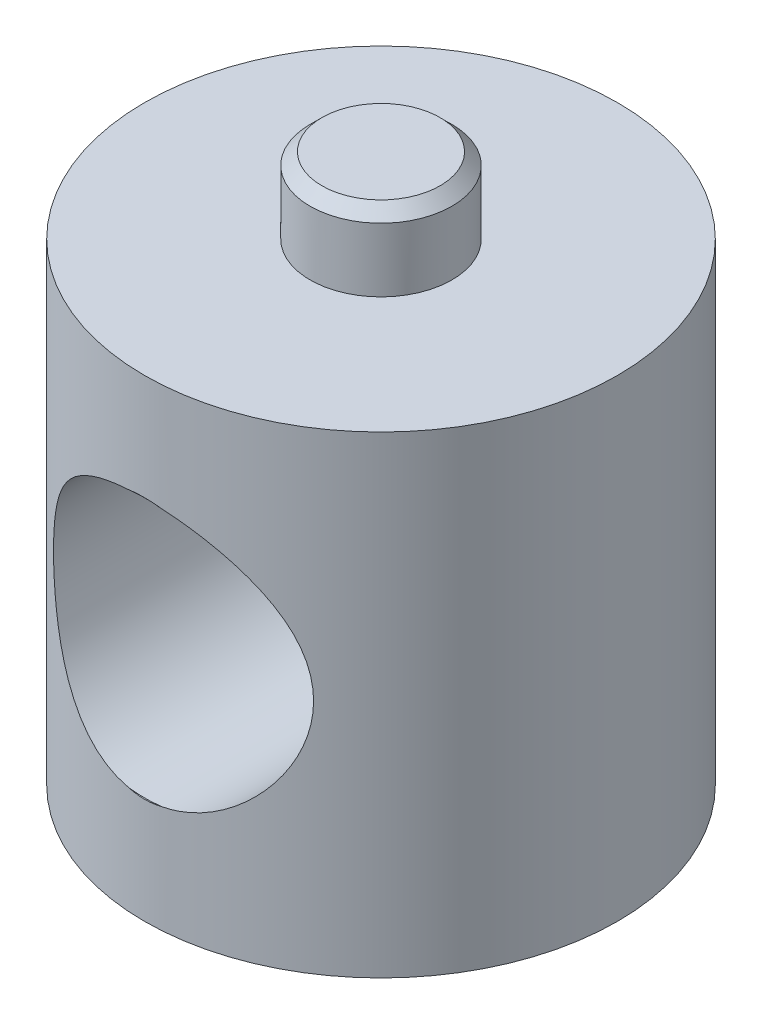
ISO-10303-21;
HEADER;
FILE_DESCRIPTION(('STEP AP214'),'2;1');
FILE_NAME('part.step','',(''),(''),'','','');
FILE_SCHEMA(('AUTOMOTIVE_DESIGN { 1 0 10303 214 1 1 1 1 }'));
ENDSEC;
DATA;
#1=APPLICATION_CONTEXT('core data for automotive mechanical design processes');
#2=APPLICATION_PROTOCOL_DEFINITION('international standard','automotive_design',2000,#1);
#3=PRODUCT_CONTEXT('',#1,'mechanical');
#4=PRODUCT('Part','Part','',(#3));
#5=PRODUCT_RELATED_PRODUCT_CATEGORY('part','',(#4));
#6=PRODUCT_DEFINITION_FORMATION('','',#4);
#7=PRODUCT_DEFINITION_CONTEXT('part definition',#1,'design');
#8=PRODUCT_DEFINITION('design','',#6,#7);
#9=PRODUCT_DEFINITION_SHAPE('','',#8);
#10=(LENGTH_UNIT() NAMED_UNIT(*) SI_UNIT(.MILLI.,.METRE.));
#11=(NAMED_UNIT(*) PLANE_ANGLE_UNIT() SI_UNIT($,.RADIAN.));
#12=(NAMED_UNIT(*) SI_UNIT($,.STERADIAN.) SOLID_ANGLE_UNIT());
#13=UNCERTAINTY_MEASURE_WITH_UNIT(LENGTH_MEASURE(1.E-05),#10,'distance_accuracy_value','');
#14=(GEOMETRIC_REPRESENTATION_CONTEXT(3) GLOBAL_UNCERTAINTY_ASSIGNED_CONTEXT((#13)) GLOBAL_UNIT_ASSIGNED_CONTEXT((#10,
#11,#12)) REPRESENTATION_CONTEXT('',''));
#15=CARTESIAN_POINT('',(0.,0.,0.));
#16=DIRECTION('',(0.,0.,1.));
#17=DIRECTION('',(1.,0.,0.));
#18=AXIS2_PLACEMENT_3D('',#15,#16,#17);
#19=CARTESIAN_POINT('',(0.,10.,0.));
#20=DIRECTION('',(0.,-1.,0.));
#21=DIRECTION('',(0.,0.,-1.));
#22=AXIS2_PLACEMENT_3D('',#19,#20,#21);
#23=CYLINDRICAL_SURFACE('',#22,10.);
#24=CARTESIAN_POINT('',(-0.706664701255159,-5.454413350673,9.975));
#25=CARTESIAN_POINT('',(-0.854330324366401,-5.43530650479493,9.96456689214741));
#26=CARTESIAN_POINT('',(-1.00095180597764,-5.41019046053032,9.95085742333299));
#27=CARTESIAN_POINT('',(-1.29093530125566,-5.34839929825909,9.91738995039539));
#28=CARTESIAN_POINT('',(-1.43429944781083,-5.31173199237408,9.89763603439199));
#29=CARTESIAN_POINT('',(-1.71604536450925,-5.22749605971397,9.85268871388454));
#30=CARTESIAN_POINT('',(-1.85444964384357,-5.17998666349683,9.82752490549099));
#31=CARTESIAN_POINT('',(-2.12621317412603,-5.07449155482075,9.77233028605143));
#32=CARTESIAN_POINT('',(-2.25957169656386,-5.01650433649349,9.7422987754852));
#33=CARTESIAN_POINT('',(-2.52013408126051,-4.89078655581773,9.67816498845069));
#34=CARTESIAN_POINT('',(-2.64735328734199,-4.82308216610034,9.64407368749441));
#35=CARTESIAN_POINT('',(-2.89541798578991,-4.67837491289358,9.57252555979814));
#36=CARTESIAN_POINT('',(-3.01626122007816,-4.60136878649364,9.53506755325406));
#37=CARTESIAN_POINT('',(-3.36865015656044,-4.35705423190807,9.41877420285488));
#38=CARTESIAN_POINT('',(-3.58990819440035,-4.17652110164189,9.33605714988633));
#39=CARTESIAN_POINT('',(-4.01862575629449,-3.76770867217193,9.1601739947386));
#40=CARTESIAN_POINT('',(-4.22335975226507,-3.53669074319817,9.06671418018226));
#41=CARTESIAN_POINT('',(-4.49997791219835,-3.16607266436285,8.93089117711794));
#42=CARTESIAN_POINT('',(-4.58714960466196,-3.03842848917208,8.88631744330544));
#43=CARTESIAN_POINT('',(-4.75083594914128,-2.77552247323073,8.79989260278936));
#44=CARTESIAN_POINT('',(-4.82734901542374,-2.64025950319157,8.75804190169653));
#45=CARTESIAN_POINT('',(-4.97172675539674,-2.35755486767525,8.67692652534718));
#46=CARTESIAN_POINT('',(-5.03915834122453,-2.20984654929708,8.6378181468935));
#47=CARTESIAN_POINT('',(-5.16106642956183,-1.90784875780278,8.56553660234757));
#48=CARTESIAN_POINT('',(-5.21554984766685,-1.75356284993629,8.53236027031427));
#49=CARTESIAN_POINT('',(-5.310767672772,-1.43965488819852,8.47342225928111));
#50=CARTESIAN_POINT('',(-5.35152155270893,-1.28004074790648,8.44765008649118));
#51=CARTESIAN_POINT('',(-5.4186707822354,-0.956688354327898,8.40473719497835));
#52=CARTESIAN_POINT('',(-5.44506945266961,-0.792951064043324,8.38759448003868));
#53=CARTESIAN_POINT('',(-5.4803615858068,-0.485908493630901,8.36456864113809));
#54=CARTESIAN_POINT('',(-5.49117258810863,-0.342912895864193,8.35745524830813));
#55=CARTESIAN_POINT('',(-5.50157934701745,-0.0563425288850063,8.35060882042396));
#56=CARTESIAN_POINT('',(-5.50117624068946,0.0872321801319118,8.35087503710734));
#57=CARTESIAN_POINT('',(-5.48916245358449,0.373696648372619,8.35877652674409));
#58=CARTESIAN_POINT('',(-5.47755222003917,0.516586434700263,8.36641150563961));
#59=CARTESIAN_POINT('',(-5.44331537627004,0.800475045984132,8.38872654075595));
#60=CARTESIAN_POINT('',(-5.42068887999134,0.941473890483537,8.40340652410777));
#61=CARTESIAN_POINT('',(-5.36732291492736,1.20770523019348,8.43757955033609));
#62=CARTESIAN_POINT('',(-5.33751627911903,1.33319899859485,8.45650864422377));
#63=CARTESIAN_POINT('',(-5.26942061372555,1.58105729784044,8.49910664249209));
#64=CARTESIAN_POINT('',(-5.23112882493839,1.70342079631301,8.52277708842452));
#65=CARTESIAN_POINT('',(-5.1040701089312,2.06485286582816,8.59990234191633));
#66=CARTESIAN_POINT('',(-5.00308621090206,2.29842798016694,8.65949367706638));
#67=CARTESIAN_POINT('',(-4.75839035938452,2.77251015106189,8.79655917431136));
#68=CARTESIAN_POINT('',(-4.61113298032855,3.01080269748691,8.87529463802709));
#69=CARTESIAN_POINT('',(-4.28328645097497,3.46139192237403,9.03808871446318));
#70=CARTESIAN_POINT('',(-4.10266449031997,3.6736626664381,9.12215251308715));
#71=CARTESIAN_POINT('',(-3.68336187694704,4.09674676313861,9.30007916918674));
#72=CARTESIAN_POINT('',(-3.44009397141891,4.3032018508182,9.39366766015976));
#73=CARTESIAN_POINT('',(-3.049434317012,4.58000720956057,9.52470082890058));
#74=CARTESIAN_POINT('',(-2.91494146824873,4.66678656834076,9.56681520844634));
#75=CARTESIAN_POINT('',(-2.6379875117969,4.828737629328,9.64685127674152));
#76=CARTESIAN_POINT('',(-2.49553095991708,4.90391587747894,9.68477532643469));
#77=CARTESIAN_POINT('',(-2.22176888483978,5.0332611299264,9.75095030520816));
#78=CARTESIAN_POINT('',(-2.09129529542767,5.08887987312019,9.77981781052874));
#79=CARTESIAN_POINT('',(-1.82562099422424,5.19011651670924,9.83287621097573));
#80=CARTESIAN_POINT('',(-1.69042136251818,5.23573668506613,9.85706816650261));
#81=CARTESIAN_POINT('',(-1.41550828592736,5.31666594327772,9.90028998283285));
#82=CARTESIAN_POINT('',(-1.2757779352821,5.35192986409853,9.91929720540082));
#83=CARTESIAN_POINT('',(-0.993250810499917,5.41150400501546,9.95157365509318));
#84=CARTESIAN_POINT('',(-0.850451932380449,5.43580644071989,9.96483880416681));
#85=CARTESIAN_POINT('',(-0.706664701255159,5.454413350673,9.975));
#86=B_SPLINE_CURVE_WITH_KNOTS('',3,(#24,#25,#26,#27,#28,#29,#30,#31,#32,#33,#34,#35,#36,#37,#38,
#39,#40,#41,#42,#43,#44,#45,#46,#47,#48,#49,#50,#51,#52,#53,#54,#55,#56,#57,#58,#59,#60,#61,#62,
#63,#64,#65,#66,#67,#68,#69,#70,#71,#72,#73,#74,#75,#76,#77,#78,#79,#80,#81,#82,#83,#84,#85),
.UNSPECIFIED.,.F.,.F.,(4,2,2,2,2,2,2,2,2,2,2,2,2,2,2,2,2,2,2,2,2,2,2,2,2,2,2,2,2,2,4),(0.,
0.447576357777726,0.894850667017765,1.33973764383864,1.78468861056363,2.22846286765794,
2.67239324869998,3.5607513626599,4.52382312816284,5.00597792477008,5.48820437734771,
5.98855374400733,6.4886352712553,6.98800450490311,7.48725816838818,7.9173919284976,
8.34748207495208,8.77755505893793,9.20762359462123,9.59830361620215,9.98911086602813,
10.770221149226,11.6398570551908,12.5103527486811,13.5026280826545,13.9986311213084,
14.4943532580238,14.9281115715392,15.3617713942501,15.7972954631183,16.2331283379998),.UNSPECIFIED.);
#87=CARTESIAN_POINT('',(-0.706664701255159,-5.45441335067301,9.975));
#88=VERTEX_POINT('',#87);
#89=CARTESIAN_POINT('',(-0.706664701255159,5.45441335067301,9.975));
#90=VERTEX_POINT('',#89);
#91=EDGE_CURVE('E78',#88,#90,#86,.T.);
#92=ORIENTED_EDGE('',*,*,#91,.T.);
#93=CARTESIAN_POINT('',(-0.74379614814816,5.44674899182989,9.9723));
#94=CARTESIAN_POINT('',(-0.649855796940511,5.46667310119513,9.9793195615911));
#95=CARTESIAN_POINT('',(-0.555015841483852,5.48286719990757,9.98504614374056));
#96=CARTESIAN_POINT('',(-0.364174292068488,5.50762761386662,9.9938199259689));
#97=CARTESIAN_POINT('',(-0.268172123410899,5.5161899849476,9.99686574058575));
#98=CARTESIAN_POINT('',(-0.0775080093261917,5.52541282039159,10.0001467279289));
#99=CARTESIAN_POINT('',(0.0171461966403247,5.52621542407307,10.000432458333));
#100=CARTESIAN_POINT('',(0.206136116560112,5.52028179618861,9.99832112836219));
#101=CARTESIAN_POINT('',(0.300471993206262,5.51355029907227,9.99592575280153));
#102=CARTESIAN_POINT('',(0.452869546049262,5.49660198464245,9.98991222977542));
#103=CARTESIAN_POINT('',(0.511225828760554,5.48864920869207,9.98709316143598));
#104=CARTESIAN_POINT('',(0.62776502006412,5.46985950447552,9.98044799963917));
#105=CARTESIAN_POINT('',(0.685944933746981,5.4590060297091,9.97661613027521));
#106=CARTESIAN_POINT('',(0.743796148163821,5.44674899182658,9.97229999999883));
#107=B_SPLINE_CURVE_WITH_KNOTS('',3,(#93,#94,#95,#96,#97,#98,#99,#100,#101,#102,#103,#104,#105,
#106),.UNSPECIFIED.,.F.,.F.,(4,2,2,2,2,2,4),(0.,0.288793247909487,0.577735661133362,
0.861375125281459,1.14483644963729,1.32165368675844,1.49950190762229),.UNSPECIFIED.);
#108=CARTESIAN_POINT('',(0.706664701255159,5.45441335067301,9.975));
#109=VERTEX_POINT('',#108);
#110=EDGE_CURVE('E82',#90,#109,#107,.T.);
#111=ORIENTED_EDGE('',*,*,#110,.T.);
#112=CARTESIAN_POINT('',(0.706664701255159,5.454413350673,9.975));
#113=CARTESIAN_POINT('',(0.854330324366401,5.43530650479493,9.96456689214741));
#114=CARTESIAN_POINT('',(1.00095180597764,5.41019046053032,9.95085742333299));
#115=CARTESIAN_POINT('',(1.29093530125566,5.34839929825909,9.91738995039539));
#116=CARTESIAN_POINT('',(1.43429944781083,5.31173199237408,9.89763603439199));
#117=CARTESIAN_POINT('',(1.71604536450925,5.22749605971397,9.85268871388454));
#118=CARTESIAN_POINT('',(1.85444964384357,5.17998666349683,9.82752490549099));
#119=CARTESIAN_POINT('',(2.12621317412603,5.07449155482075,9.77233028605143));
#120=CARTESIAN_POINT('',(2.25957169656386,5.01650433649349,9.7422987754852));
#121=CARTESIAN_POINT('',(2.52013408126051,4.89078655581773,9.67816498845069));
#122=CARTESIAN_POINT('',(2.64735328734199,4.82308216610034,9.64407368749441));
#123=CARTESIAN_POINT('',(2.89541798578991,4.67837491289358,9.57252555979814));
#124=CARTESIAN_POINT('',(3.01626122007816,4.60136878649364,9.53506755325406));
#125=CARTESIAN_POINT('',(3.36865015656044,4.35705423190807,9.41877420285488));
#126=CARTESIAN_POINT('',(3.58990819440035,4.17652110164189,9.33605714988633));
#127=CARTESIAN_POINT('',(4.01862575629449,3.76770867217193,9.1601739947386));
#128=CARTESIAN_POINT('',(4.22335975226507,3.53669074319817,9.06671418018226));
#129=CARTESIAN_POINT('',(4.49997791219835,3.16607266436285,8.93089117711794));
#130=CARTESIAN_POINT('',(4.58714960466196,3.03842848917208,8.88631744330544));
#131=CARTESIAN_POINT('',(4.75083594914128,2.77552247323073,8.79989260278936));
#132=CARTESIAN_POINT('',(4.82734901542374,2.64025950319157,8.75804190169653));
#133=CARTESIAN_POINT('',(4.97172675539674,2.35755486767525,8.67692652534718));
#134=CARTESIAN_POINT('',(5.03915834122453,2.20984654929708,8.6378181468935));
#135=CARTESIAN_POINT('',(5.16106642956183,1.90784875780278,8.56553660234757));
#136=CARTESIAN_POINT('',(5.21554984766685,1.75356284993629,8.53236027031427));
#137=CARTESIAN_POINT('',(5.310767672772,1.43965488819852,8.47342225928111));
#138=CARTESIAN_POINT('',(5.35152155270893,1.28004074790648,8.44765008649118));
#139=CARTESIAN_POINT('',(5.4186707822354,0.956688354327898,8.40473719497835));
#140=CARTESIAN_POINT('',(5.44506945266961,0.792951064043324,8.38759448003868));
#141=CARTESIAN_POINT('',(5.4803615858068,0.485908493630901,8.36456864113809));
#142=CARTESIAN_POINT('',(5.49117258810863,0.342912895864193,8.35745524830813));
#143=CARTESIAN_POINT('',(5.50157934701745,0.0563425288850063,8.35060882042396));
#144=CARTESIAN_POINT('',(5.50117624068946,-0.0872321801319118,8.35087503710734));
#145=CARTESIAN_POINT('',(5.48916245358449,-0.373696648372619,8.35877652674409));
#146=CARTESIAN_POINT('',(5.47755222003917,-0.516586434700263,8.36641150563961));
#147=CARTESIAN_POINT('',(5.44331537627004,-0.800475045984132,8.38872654075595));
#148=CARTESIAN_POINT('',(5.42068887999134,-0.941473890483537,8.40340652410777));
#149=CARTESIAN_POINT('',(5.36732291492736,-1.20770523019348,8.43757955033609));
#150=CARTESIAN_POINT('',(5.33751627911903,-1.33319899859485,8.45650864422377));
#151=CARTESIAN_POINT('',(5.26942061372555,-1.58105729784044,8.49910664249209));
#152=CARTESIAN_POINT('',(5.23112882493839,-1.70342079631301,8.52277708842452));
#153=CARTESIAN_POINT('',(5.1040701089312,-2.06485286582816,8.59990234191633));
#154=CARTESIAN_POINT('',(5.00308621090206,-2.29842798016694,8.65949367706638));
#155=CARTESIAN_POINT('',(4.75839035938452,-2.77251015106189,8.79655917431136));
#156=CARTESIAN_POINT('',(4.61113298032855,-3.01080269748691,8.87529463802709));
#157=CARTESIAN_POINT('',(4.28328645097497,-3.46139192237403,9.03808871446318));
#158=CARTESIAN_POINT('',(4.10266449031997,-3.6736626664381,9.12215251308715));
#159=CARTESIAN_POINT('',(3.68336187694704,-4.09674676313861,9.30007916918674));
#160=CARTESIAN_POINT('',(3.44009397141891,-4.3032018508182,9.39366766015976));
#161=CARTESIAN_POINT('',(3.049434317012,-4.58000720956057,9.52470082890058));
#162=CARTESIAN_POINT('',(2.91494146824873,-4.66678656834076,9.56681520844634));
#163=CARTESIAN_POINT('',(2.6379875117969,-4.828737629328,9.64685127674152));
#164=CARTESIAN_POINT('',(2.49553095991708,-4.90391587747894,9.68477532643469));
#165=CARTESIAN_POINT('',(2.22176888483978,-5.0332611299264,9.75095030520816));
#166=CARTESIAN_POINT('',(2.09129529542767,-5.08887987312019,9.77981781052874));
#167=CARTESIAN_POINT('',(1.82562099422424,-5.19011651670924,9.83287621097573));
#168=CARTESIAN_POINT('',(1.69042136251818,-5.23573668506613,9.85706816650261));
#169=CARTESIAN_POINT('',(1.41550828592736,-5.31666594327772,9.90028998283285));
#170=CARTESIAN_POINT('',(1.2757779352821,-5.35192986409853,9.91929720540082));
#171=CARTESIAN_POINT('',(0.993250810499917,-5.41150400501546,9.95157365509318));
#172=CARTESIAN_POINT('',(0.850451932380449,-5.43580644071989,9.96483880416681));
#173=CARTESIAN_POINT('',(0.706664701255159,-5.454413350673,9.975));
#174=B_SPLINE_CURVE_WITH_KNOTS('',3,(#112,#113,#114,#115,#116,#117,#118,#119,#120,#121,#122,
#123,#124,#125,#126,#127,#128,#129,#130,#131,#132,#133,#134,#135,#136,#137,#138,#139,#140,#141,
#142,#143,#144,#145,#146,#147,#148,#149,#150,#151,#152,#153,#154,#155,#156,#157,#158,#159,#160,
#161,#162,#163,#164,#165,#166,#167,#168,#169,#170,#171,#172,#173),.UNSPECIFIED.,.F.,.F.,(4,2,2,
2,2,2,2,2,2,2,2,2,2,2,2,2,2,2,2,2,2,2,2,2,2,2,2,2,2,2,4),(0.,0.447576357777726,
0.894850667017765,1.33973764383864,1.78468861056363,2.22846286765794,2.67239324869998,
3.5607513626599,4.52382312816284,5.00597792477008,5.48820437734771,5.98855374400733,
6.4886352712553,6.98800450490311,7.48725816838818,7.9173919284976,8.34748207495208,
8.77755505893793,9.20762359462123,9.59830361620215,9.98911086602813,10.770221149226,
11.6398570551908,12.5103527486811,13.5026280826545,13.9986311213084,14.4943532580238,
14.9281115715392,15.3617713942501,15.7972954631183,16.2331283379998),.UNSPECIFIED.);
#175=CARTESIAN_POINT('',(0.706664701255159,-5.45441335067301,9.975));
#176=VERTEX_POINT('',#175);
#177=EDGE_CURVE('E70',#109,#176,#174,.T.);
#178=ORIENTED_EDGE('',*,*,#177,.T.);
#179=CARTESIAN_POINT('',(0.743796148163821,-5.44674899182658,9.97229999999883));
#180=CARTESIAN_POINT('',(0.64985579695627,-5.46667310119222,9.97931956159007));
#181=CARTESIAN_POINT('',(0.555015841499692,-5.48286719990508,9.98504614373968));
#182=CARTESIAN_POINT('',(0.364174292084451,-5.50762761386498,9.99381992596832));
#183=CARTESIAN_POINT('',(0.268172123426904,-5.51618998494639,9.99686574058532));
#184=CARTESIAN_POINT('',(0.0775080093422428,-5.52541282039125,10.0001467279287));
#185=CARTESIAN_POINT('',(-0.0171461966242695,-5.52621542407315,10.000432458333));
#186=CARTESIAN_POINT('',(-0.206136116544086,-5.52028179618954,9.99832112836252));
#187=CARTESIAN_POINT('',(-0.30047199319027,-5.51355029907363,9.99592575280201));
#188=CARTESIAN_POINT('',(-0.452869546033354,-5.49660198464449,9.98991222977614));
#189=CARTESIAN_POINT('',(-0.511225828744686,-5.48864920869437,9.98709316143679));
#190=CARTESIAN_POINT('',(-0.627765020048345,-5.46985950447833,9.98044799964016));
#191=CARTESIAN_POINT('',(-0.685944933731259,-5.45900602971216,9.97661613027629));
#192=CARTESIAN_POINT('',(-0.74379614814816,-5.44674899182989,9.9723));
#193=B_SPLINE_CURVE_WITH_KNOTS('',3,(#179,#180,#181,#182,#183,#184,#185,#186,#187,#188,#189,
#190,#191,#192),.UNSPECIFIED.,.F.,.F.,(4,2,2,2,2,2,4),(0.,0.288793247909486,0.577735661133364,
0.861375125281461,1.14483644963729,1.32165368675844,1.49950190762229),.UNSPECIFIED.);
#194=EDGE_CURVE('E61',#176,#88,#193,.T.);
#195=ORIENTED_EDGE('',*,*,#194,.T.);
#196=EDGE_LOOP('',(#92,#111,#178,#195));
#197=FACE_BOUND('',#196,.T.);
#198=CARTESIAN_POINT('',(0.,5.5,-10.));
#199=CARTESIAN_POINT('',(-0.142841752058878,5.50000149980613,-10.0000013253171));
#200=CARTESIAN_POINT('',(-0.285665986079781,5.49443023671653,-9.9969335195706));
#201=CARTESIAN_POINT('',(-0.570239689293178,5.47222036742004,-9.98474372414085));
#202=CARTESIAN_POINT('',(-0.711988829035868,5.45557849716682,-9.97561994892361));
#203=CARTESIAN_POINT('',(-0.993411840442093,5.41141780319423,-9.95153761632946));
#204=CARTESIAN_POINT('',(-1.1330835984815,5.38388859577062,-9.9365734889463));
#205=CARTESIAN_POINT('',(-1.40927178286025,5.31828076940129,-9.9011791338125));
#206=CARTESIAN_POINT('',(-1.54578689583191,5.28019784204949,-9.88074667380979));
#207=CARTESIAN_POINT('',(-1.81410275102406,5.19411082327296,-9.83501204865348));
#208=CARTESIAN_POINT('',(-1.94592224152469,5.14615302910586,-9.80973264463814));
#209=CARTESIAN_POINT('',(-2.20476755536611,5.04069016333131,-9.75482138133249));
#210=CARTESIAN_POINT('',(-2.33179154281556,4.98318147988967,-9.72518787595395));
#211=CARTESIAN_POINT('',(-2.70454712408485,4.79712773571481,-9.63072907142522));
#212=CARTESIAN_POINT('',(-2.94222352099016,4.65497016587907,-9.56029904906485));
#213=CARTESIAN_POINT('',(-3.40709885210692,4.32759504849627,-9.40510071299984));
#214=CARTESIAN_POINT('',(-3.63245231290911,4.14008808813611,-9.31967934451281));
#215=CARTESIAN_POINT('',(-4.05027005649351,3.73238148758027,-9.14585008459779));
#216=CARTESIAN_POINT('',(-4.24270359328259,3.51215164018021,-9.057439492628));
#217=CARTESIAN_POINT('',(-4.60842590708714,3.01918055917078,-8.87738336369874));
#218=CARTESIAN_POINT('',(-4.77796075069635,2.74340349740146,-8.78627724878626));
#219=CARTESIAN_POINT('',(-4.99508838788048,2.30770425817949,-8.6634891383539));
#220=CARTESIAN_POINT('',(-5.06128412115967,2.15874636686446,-8.6248612077339));
#221=CARTESIAN_POINT('',(-5.1805658273668,1.85429608121645,-8.55374495363448));
#222=CARTESIAN_POINT('',(-5.23366028561747,1.69880799308455,-8.52125265949637));
#223=CARTESIAN_POINT('',(-5.32309800232022,1.39230175396711,-8.46565009064032));
#224=CARTESIAN_POINT('',(-5.3602810293766,1.24161193118373,-8.4420802476158));
#225=CARTESIAN_POINT('',(-5.42187353079098,0.936722997674776,-8.40265611303222));
#226=CARTESIAN_POINT('',(-5.4462905446175,0.782526014523399,-8.38679726783014));
#227=CARTESIAN_POINT('',(-5.48192299182762,0.472124902493611,-8.36355045676607));
#228=CARTESIAN_POINT('',(-5.49315107892035,0.315922843054833,-8.35615437174649));
#229=CARTESIAN_POINT('',(-5.50222552899403,0.00297095213551361,-8.35018254815688));
#230=CARTESIAN_POINT('',(-5.50007372257812,-0.153778801478074,-8.35160560297439));
#231=CARTESIAN_POINT('',(-5.48378840679718,-0.442323807074128,-8.362304177594));
#232=CARTESIAN_POINT('',(-5.47153363404034,-0.574276523442408,-8.37034812856275));
#233=CARTESIAN_POINT('',(-5.4376233073864,-0.836501569762733,-8.39241700242708));
#234=CARTESIAN_POINT('',(-5.41596489317585,-0.966773376006393,-8.40644374509048));
#235=CARTESIAN_POINT('',(-5.36351893970939,-1.2247394112197,-8.44000182353257));
#236=CARTESIAN_POINT('',(-5.3327314211979,-1.35243364604575,-8.45953314680297));
#237=CARTESIAN_POINT('',(-5.26237647986399,-1.60453922881103,-8.50347627264488));
#238=CARTESIAN_POINT('',(-5.22280555536867,-1.72894924523779,-8.52789002130325));
#239=CARTESIAN_POINT('',(-5.08962534035009,-2.1014586579969,-8.60852268821013));
#240=CARTESIAN_POINT('',(-4.9826468965488,-2.34348586593038,-8.67139237679696));
#241=CARTESIAN_POINT('',(-4.7369018670231,-2.80727834667939,-8.80803472474407));
#242=CARTESIAN_POINT('',(-4.59812156040827,-3.02903481575989,-8.88181208532226));
#243=CARTESIAN_POINT('',(-4.2672928416758,-3.48296260868179,-9.04596391719774));
#244=CARTESIAN_POINT('',(-4.07029459887437,-3.71125629286741,-9.13712038619752));
#245=CARTESIAN_POINT('',(-3.6407717221147,-4.13345250361016,-9.31659078642609));
#246=CARTESIAN_POINT('',(-3.40822298418384,-4.32733150208426,-9.40490273945531));
#247=CARTESIAN_POINT('',(-3.02769936677206,-4.59448313415318,-9.53166449287199));
#248=CARTESIAN_POINT('',(-2.89078692652741,-4.68186793498166,-9.5741788439289));
#249=CARTESIAN_POINT('',(-2.60880759779842,-4.84464559792215,-9.65482165281565));
#250=CARTESIAN_POINT('',(-2.46374422978985,-4.92004358420025,-9.69295198280235));
#251=CARTESIAN_POINT('',(-2.16643764569557,-5.05800310921392,-9.76370281263216));
#252=CARTESIAN_POINT('',(-2.01419808546738,-5.12057109900368,-9.79632608001704));
#253=CARTESIAN_POINT('',(-1.70360443439008,-5.23210702924905,-9.85508466904527));
#254=CARTESIAN_POINT('',(-1.54525121703052,-5.28107690440648,-9.88122091358791));
#255=CARTESIAN_POINT('',(-1.23876719934142,-5.3607969685821,-9.92406797790066));
#256=CARTESIAN_POINT('',(-1.09105745977756,-5.39281906435487,-9.94142981891385));
#257=CARTESIAN_POINT('',(-0.792902539913911,-5.44464810843134,-9.96963983396893));
#258=CARTESIAN_POINT('',(-0.642457675275712,-5.46445645722921,-9.98048875481365));
#259=CARTESIAN_POINT('',(-0.340185751134485,-5.49156526163976,-9.99535695727727));
#260=CARTESIAN_POINT('',(-0.18835943190552,-5.49887206041215,-9.99937970241998));
#261=CARTESIAN_POINT('',(0.115397784685621,-5.50088596413533,-10.000487212106));
#262=CARTESIAN_POINT('',(0.267328674645221,-5.49559388433811,-9.99757242556526));
#263=CARTESIAN_POINT('',(0.555090017146405,-5.47362884726594,-9.98551656359033));
#264=CARTESIAN_POINT('',(0.69103840417558,-5.45812273443401,-9.97701403759353));
#265=CARTESIAN_POINT('',(0.961013435543875,-5.41711173291131,-9.95463729187315));
#266=CARTESIAN_POINT('',(1.09503946994524,-5.39160374044915,-9.94076140471112));
#267=CARTESIAN_POINT('',(1.36019343131532,-5.33088810628736,-9.90796226724197));
#268=CARTESIAN_POINT('',(1.49132227054391,-5.29568356621557,-9.88904063097659));
#269=CARTESIAN_POINT('',(1.74998258370257,-5.21592634125977,-9.8465602681033));
#270=CARTESIAN_POINT('',(1.87751263214375,-5.17137000947496,-9.82299973269512));
#271=CARTESIAN_POINT('',(2.13100055929735,-5.07225389346938,-9.77117873265241));
#272=CARTESIAN_POINT('',(2.25686186442489,-5.01749530623515,-9.74282613973581));
#273=CARTESIAN_POINT('',(2.50344497450167,-4.89913107625152,-9.68240175637615));
#274=CARTESIAN_POINT('',(2.62416502847458,-4.83552245038677,-9.65032871247552));
#275=CARTESIAN_POINT('',(2.97774605394808,-4.63216005157313,-9.5495015352806));
#276=CARTESIAN_POINT('',(3.20217216376082,-4.47981278994497,-9.47610871849305));
#277=CARTESIAN_POINT('',(3.64857882136404,-4.1264715796,-9.31399109156981));
#278=CARTESIAN_POINT('',(3.86747318592925,-3.92194105118301,-9.22446967649404));
#279=CARTESIAN_POINT('',(4.16880320735542,-3.5907416514808,-9.09028347654795));
#280=CARTESIAN_POINT('',(4.26481547517286,-3.47616562201963,-9.04553232220247));
#281=CARTESIAN_POINT('',(4.44742755665807,-3.23925107021133,-8.9571569588291));
#282=CARTESIAN_POINT('',(4.5340257104432,-3.11691118495572,-8.91353294956809));
#283=CARTESIAN_POINT('',(4.70364737374316,-2.85515161135004,-8.82527898219404));
#284=CARTESIAN_POINT('',(4.78586336984146,-2.71514423006331,-8.78083658924528));
#285=CARTESIAN_POINT('',(4.938007141994,-2.42745650114731,-8.6961866776151));
#286=CARTESIAN_POINT('',(5.00794079563639,-2.27977986763902,-8.65597713705672));
#287=CARTESIAN_POINT('',(5.13475179600473,-1.97765915381541,-8.58135986731129));
#288=CARTESIAN_POINT('',(5.19164105655858,-1.82322140342895,-8.54694685167459));
#289=CARTESIAN_POINT('',(5.29164807133967,-1.50854225362718,-8.4853944161148));
#290=CARTESIAN_POINT('',(5.33476840114518,-1.34830194587347,-8.45825363602035));
#291=CARTESIAN_POINT('',(5.40303118984829,-1.03914838620938,-8.41479223555946));
#292=CARTESIAN_POINT('',(5.42951066498988,-0.890641816029558,-8.39767807342413));
#293=CARTESIAN_POINT('',(5.47021149205791,-0.591268066641383,-8.37122340830919));
#294=CARTESIAN_POINT('',(5.48443375353873,-0.440401063436512,-8.36188232852482));
#295=CARTESIAN_POINT('',(5.50035784337409,-0.137832093656094,-8.35141637552306));
#296=CARTESIAN_POINT('',(5.50206881956722,0.0138691816902912,-8.35028549928033));
#297=CARTESIAN_POINT('',(5.49296232983145,0.3167212357622,-8.35627878087188));
#298=CARTESIAN_POINT('',(5.48214589689606,0.467872058846376,-8.36340225806316));
#299=CARTESIAN_POINT('',(5.45050665725191,0.747665901051135,-8.38404884662754));
#300=CARTESIAN_POINT('',(5.43125166885692,0.876564356428455,-8.39656541507773));
#301=CARTESIAN_POINT('',(5.38380329531334,1.13206356707857,-8.42706636056067));
#302=CARTESIAN_POINT('',(5.35560704402958,1.25866357180279,-8.44505249079367));
#303=CARTESIAN_POINT('',(5.25805956141963,1.63385332785332,-8.50639672586411));
#304=CARTESIAN_POINT('',(5.17573170161389,1.87798711655137,-8.55715312962816));
#305=CARTESIAN_POINT('',(4.97351417539059,2.36383687257465,-8.67632720331984));
#306=CARTESIAN_POINT('',(4.851632703989,2.60448886230292,-8.74563621099548));
#307=CARTESIAN_POINT('',(4.57561608218592,3.06357785764246,-8.89315570661007));
#308=CARTESIAN_POINT('',(4.42146381549143,3.28200298248604,-8.9713709082756));
#309=CARTESIAN_POINT('',(4.05717828293991,3.72616283709994,-9.14253204899319));
#310=CARTESIAN_POINT('',(3.84205672204817,3.94766945715436,-9.235864108763));
#311=CARTESIAN_POINT('',(3.37593042311172,4.35297276916203,-9.4162312520407));
#312=CARTESIAN_POINT('',(3.12490013907635,4.5367423858173,-9.50326178558825));
#313=CARTESIAN_POINT('',(2.72071902073227,4.78265687871642,-9.62385148160563));
#314=CARTESIAN_POINT('',(2.57870041732791,4.86073473030591,-9.66296672375162));
#315=CARTESIAN_POINT('',(2.28727806087811,5.00446944822412,-9.73606040387869));
#316=CARTESIAN_POINT('',(2.13787797587978,5.0701324070663,-9.7700413598182));
#317=CARTESIAN_POINT('',(1.83300600966548,5.18813647490234,-9.83179734063237));
#318=CARTESIAN_POINT('',(1.67754638551483,5.24050301509118,-9.85958419992875));
#319=CARTESIAN_POINT('',(1.36162430458018,5.33131998429341,-9.90815319038245));
#320=CARTESIAN_POINT('',(1.2011645142698,5.36977769715225,-9.92893898749869));
#321=CARTESIAN_POINT('',(0.868435169900306,5.43377849510211,-9.96369342403182));
#322=CARTESIAN_POINT('',(0.69597854854053,5.45857088261747,-9.97726455865953));
#323=CARTESIAN_POINT('',(0.349005884743478,5.49168060010353,-9.99541697228057));
#324=CARTESIAN_POINT('',(0.174489872071037,5.49999816789575,-9.99999838104469));
#325=CARTESIAN_POINT('',(0.,5.5,-10.));
#326=B_SPLINE_CURVE_WITH_KNOTS('',3,(#198,#199,#200,#201,#202,#203,#204,#205,#206,#207,#208,
#209,#210,#211,#212,#213,#214,#215,#216,#217,#218,#219,#220,#221,#222,#223,#224,#225,#226,#227,
#228,#229,#230,#231,#232,#233,#234,#235,#236,#237,#238,#239,#240,#241,#242,#243,#244,#245,#246,
#247,#248,#249,#250,#251,#252,#253,#254,#255,#256,#257,#258,#259,#260,#261,#262,#263,#264,#265,
#266,#267,#268,#269,#270,#271,#272,#273,#274,#275,#276,#277,#278,#279,#280,#281,#282,#283,#284,
#285,#286,#287,#288,#289,#290,#291,#292,#293,#294,#295,#296,#297,#298,#299,#300,#301,#302,#303,
#304,#305,#306,#307,#308,#309,#310,#311,#312,#313,#314,#315,#316,#317,#318,#319,#320,#321,#322,
#323,#324,#325),.UNSPECIFIED.,.T.,.F.,(4,2,2,2,2,2,2,2,2,2,2,2,2,2,2,2,2,2,2,2,2,2,2,2,2,2,2,2,
2,2,2,2,2,2,2,2,2,2,2,2,2,2,2,2,2,2,2,2,2,2,2,2,2,2,2,2,2,2,2,2,2,2,2,4),(0.,0.42835450083162,
0.85683535326925,1.28572585498715,1.71479170373485,2.14188994581636,2.56915007181696,
3.42284428470344,4.3352646920303,5.24853266826638,6.25177572751265,6.75372702641161,
7.25535236736979,7.72561526965102,8.19560012515658,8.6651336989287,9.13460303372057,
9.53242317074401,9.93036439791496,10.3283047208361,10.7264039761387,11.5389600350193,
12.3518673328937,13.293040231005,14.2348541175191,14.7379644883097,15.2408592060021,
15.743500439655,16.2460701222302,16.7018447273943,17.157567061258,17.6130580975835,
18.06851966066,18.4793205623039,18.8902490442125,19.301046235061,19.7120039223647,
20.1320176181854,20.552173234127,21.3920151581045,22.3258728342409,22.7936061040557,
23.2614217106041,23.7657769639548,24.2698902017559,24.7735411676835,25.2770978667837,
25.7318681051628,26.1866045941192,26.6410085614969,27.0953750619945,27.4877060268677,
27.8801628813624,28.6646145595203,29.4971139726443,30.3300560637595,31.2936579568471,
32.2579488115965,32.7575199605934,33.2568453089076,33.7552083113799,34.2533099493803,
34.7765785312483,35.2998395594409),.UNSPECIFIED.);
#327=CARTESIAN_POINT('',(0.,5.5,-10.));
#328=VERTEX_POINT('',#327);
#329=EDGE_CURVE('E124',#328,#328,#326,.T.);
#330=ORIENTED_EDGE('',*,*,#329,.T.);
#331=EDGE_LOOP('',(#330));
#332=FACE_BOUND('',#331,.T.);
#333=CARTESIAN_POINT('',(0.,10.,0.));
#334=DIRECTION('',(0.,1.,0.));
#335=DIRECTION('',(0.,0.,1.));
#336=AXIS2_PLACEMENT_3D('',#333,#334,#335);
#337=CIRCLE('',#336,10.);
#338=CARTESIAN_POINT('',(0.,10.,10.));
#339=VERTEX_POINT('',#338);
#340=EDGE_CURVE('E140',#339,#339,#337,.T.);
#341=ORIENTED_EDGE('',*,*,#340,.F.);
#342=EDGE_LOOP('',(#341));
#343=FACE_BOUND('',#342,.T.);
#344=CARTESIAN_POINT('',(0.,-10.,0.));
#345=DIRECTION('',(0.,1.,0.));
#346=DIRECTION('',(0.,0.,1.));
#347=AXIS2_PLACEMENT_3D('',#344,#345,#346);
#348=CIRCLE('',#347,10.);
#349=CARTESIAN_POINT('',(0.,-10.,10.));
#350=VERTEX_POINT('',#349);
#351=EDGE_CURVE('E136',#350,#350,#348,.T.);
#352=ORIENTED_EDGE('',*,*,#351,.T.);
#353=EDGE_LOOP('',(#352));
#354=FACE_BOUND('',#353,.T.);
#355=ADVANCED_FACE('F41',(#197,#332,#343,#354),#23,.T.);
#356=CARTESIAN_POINT('',(0.,10.,0.));
#357=DIRECTION('',(0.,1.,0.));
#358=DIRECTION('',(0.,0.,1.));
#359=AXIS2_PLACEMENT_3D('',#356,#357,#358);
#360=PLANE('',#359);
#361=CARTESIAN_POINT('',(0.,10.,0.));
#362=DIRECTION('',(0.,-1.,0.));
#363=DIRECTION('',(0.,0.,-1.));
#364=AXIS2_PLACEMENT_3D('',#361,#362,#363);
#365=CIRCLE('',#364,3.);
#366=CARTESIAN_POINT('',(0.,10.,-3.));
#367=VERTEX_POINT('',#366);
#368=EDGE_CURVE('E84',#367,#367,#365,.T.);
#369=ORIENTED_EDGE('',*,*,#368,.T.);
#370=EDGE_LOOP('',(#369));
#371=FACE_BOUND('',#370,.T.);
#372=ORIENTED_EDGE('',*,*,#340,.T.);
#373=EDGE_LOOP('',(#372));
#374=FACE_BOUND('',#373,.T.);
#375=ADVANCED_FACE('F151',(#371,#374),#360,.T.);
#376=CARTESIAN_POINT('',(0.,-10.,0.));
#377=DIRECTION('',(0.,1.,0.));
#378=DIRECTION('',(0.,0.,1.));
#379=AXIS2_PLACEMENT_3D('',#376,#377,#378);
#380=PLANE('',#379);
#381=CARTESIAN_POINT('',(0.,-10.,0.));
#382=DIRECTION('',(0.,-1.,0.));
#383=DIRECTION('',(0.,0.,-1.));
#384=AXIS2_PLACEMENT_3D('',#381,#382,#383);
#385=CIRCLE('',#384,3.);
#386=CARTESIAN_POINT('',(0.,-10.,-3.));
#387=VERTEX_POINT('',#386);
#388=EDGE_CURVE('E135',#387,#387,#385,.T.);
#389=ORIENTED_EDGE('',*,*,#388,.F.);
#390=EDGE_LOOP('',(#389));
#391=FACE_BOUND('',#390,.T.);
#392=ORIENTED_EDGE('',*,*,#351,.F.);
#393=EDGE_LOOP('',(#392));
#394=FACE_BOUND('',#393,.T.);
#395=ADVANCED_FACE('F172',(#391,#394),#380,.F.);
#396=CARTESIAN_POINT('',(0.,-13.2,0.));
#397=DIRECTION('',(0.,1.,0.));
#398=DIRECTION('',(0.,0.,1.));
#399=AXIS2_PLACEMENT_3D('',#396,#397,#398);
#400=CYLINDRICAL_SURFACE('',#399,3.);
#401=CARTESIAN_POINT('',(0.,-12.7,0.));
#402=DIRECTION('',(0.,-1.,0.));
#403=DIRECTION('',(0.,0.,-1.));
#404=AXIS2_PLACEMENT_3D('',#401,#402,#403);
#405=CIRCLE('',#404,3.);
#406=CARTESIAN_POINT('',(0.,-12.7,-3.));
#407=VERTEX_POINT('',#406);
#408=EDGE_CURVE('E93',#407,#407,#405,.F.);
#409=ORIENTED_EDGE('',*,*,#408,.T.);
#410=EDGE_LOOP('',(#409));
#411=FACE_BOUND('',#410,.T.);
#412=ORIENTED_EDGE('',*,*,#388,.T.);
#413=EDGE_LOOP('',(#412));
#414=FACE_BOUND('',#413,.T.);
#415=ADVANCED_FACE('F164',(#411,#414),#400,.T.);
#416=CARTESIAN_POINT('',(0.,-13.2,0.));
#417=DIRECTION('',(0.,-1.,0.));
#418=DIRECTION('',(0.,0.,-1.));
#419=AXIS2_PLACEMENT_3D('',#416,#417,#418);
#420=PLANE('',#419);
#421=CARTESIAN_POINT('',(0.,-13.2,0.));
#422=DIRECTION('',(0.,-1.,0.));
#423=DIRECTION('',(0.,0.,-1.));
#424=AXIS2_PLACEMENT_3D('',#421,#422,#423);
#425=CIRCLE('',#424,2.50000000000001);
#426=CARTESIAN_POINT('',(0.,-13.2,-2.50000000000001));
#427=VERTEX_POINT('',#426);
#428=EDGE_CURVE('E88',#427,#427,#425,.T.);
#429=ORIENTED_EDGE('',*,*,#428,.T.);
#430=EDGE_LOOP('',(#429));
#431=FACE_BOUND('',#430,.T.);
#432=ADVANCED_FACE('F156',(#431),#420,.T.);
#433=CARTESIAN_POINT('',(0.,13.2,0.));
#434=DIRECTION('',(0.,-1.,0.));
#435=DIRECTION('',(0.,0.,-1.));
#436=AXIS2_PLACEMENT_3D('',#433,#434,#435);
#437=CYLINDRICAL_SURFACE('',#436,3.);
#438=CARTESIAN_POINT('',(0.,12.7,0.));
#439=DIRECTION('',(0.,1.,0.));
#440=DIRECTION('',(0.,0.,1.));
#441=AXIS2_PLACEMENT_3D('',#438,#439,#440);
#442=CIRCLE('',#441,3.);
#443=CARTESIAN_POINT('',(0.,12.7,3.));
#444=VERTEX_POINT('',#443);
#445=EDGE_CURVE('E51',#444,#444,#442,.F.);
#446=ORIENTED_EDGE('',*,*,#445,.T.);
#447=EDGE_LOOP('',(#446));
#448=FACE_BOUND('',#447,.T.);
#449=ORIENTED_EDGE('',*,*,#368,.F.);
#450=EDGE_LOOP('',(#449));
#451=FACE_BOUND('',#450,.T.);
#452=ADVANCED_FACE('F154',(#448,#451),#437,.T.);
#453=CARTESIAN_POINT('',(0.,13.2,0.));
#454=DIRECTION('',(0.,1.,0.));
#455=DIRECTION('',(0.,0.,-1.));
#456=AXIS2_PLACEMENT_3D('',#453,#454,#455);
#457=PLANE('',#456);
#458=CARTESIAN_POINT('',(0.,13.2,0.));
#459=DIRECTION('',(0.,1.,0.));
#460=DIRECTION('',(0.,0.,1.));
#461=AXIS2_PLACEMENT_3D('',#458,#459,#460);
#462=CIRCLE('',#461,2.49999999999999);
#463=CARTESIAN_POINT('',(0.,13.2,2.49999999999999));
#464=VERTEX_POINT('',#463);
#465=EDGE_CURVE('E11',#464,#464,#462,.T.);
#466=ORIENTED_EDGE('',*,*,#465,.T.);
#467=EDGE_LOOP('',(#466));
#468=FACE_BOUND('',#467,.T.);
#469=ADVANCED_FACE('F113',(#468),#457,.T.);
#470=CARTESIAN_POINT('',(0.,0.,10.));
#471=DIRECTION('',(0.,0.,1.));
#472=DIRECTION('',(1.,0.,0.));
#473=AXIS2_PLACEMENT_3D('',#470,#471,#472);
#474=CONICAL_SURFACE('',#473,5.525,0.785398163397414);
#475=CARTESIAN_POINT('',(0.,0.,9.975));
#476=DIRECTION('',(0.,0.,1.));
#477=DIRECTION('',(1.,0.,0.));
#478=AXIS2_PLACEMENT_3D('',#475,#476,#477);
#479=CIRCLE('',#478,5.5);
#480=EDGE_CURVE('E73',#109,#90,#479,.T.);
#481=ORIENTED_EDGE('',*,*,#480,.F.);
#482=ORIENTED_EDGE('',*,*,#110,.F.);
#483=EDGE_LOOP('',(#481,#482));
#484=FACE_BOUND('',#483,.T.);
#485=ADVANCED_FACE('F81',(#484),#474,.F.);
#486=EDGE_CURVE('E57',#88,#176,#479,.T.);
#487=ORIENTED_EDGE('',*,*,#486,.F.);
#488=ORIENTED_EDGE('',*,*,#194,.F.);
#489=EDGE_LOOP('',(#487,#488));
#490=FACE_BOUND('',#489,.T.);
#491=ADVANCED_FACE('F112',(#490),#474,.F.);
#492=CARTESIAN_POINT('',(0.,0.,10.));
#493=DIRECTION('',(0.,0.,1.));
#494=DIRECTION('',(1.,0.,0.));
#495=AXIS2_PLACEMENT_3D('',#492,#493,#494);
#496=CYLINDRICAL_SURFACE('',#495,5.5);
#497=ORIENTED_EDGE('',*,*,#329,.F.);
#498=EDGE_LOOP('',(#497));
#499=FACE_BOUND('',#498,.T.);
#500=ORIENTED_EDGE('',*,*,#486,.T.);
#501=ORIENTED_EDGE('',*,*,#177,.F.);
#502=ORIENTED_EDGE('',*,*,#480,.T.);
#503=ORIENTED_EDGE('',*,*,#91,.F.);
#504=EDGE_LOOP('',(#500,#501,#502,#503));
#505=FACE_BOUND('',#504,.T.);
#506=ADVANCED_FACE('F72',(#499,#505),#496,.F.);
#507=CARTESIAN_POINT('',(0.,-13.2,0.));
#508=DIRECTION('',(0.,1.,0.));
#509=DIRECTION('',(0.,0.,1.));
#510=AXIS2_PLACEMENT_3D('',#507,#508,#509);
#511=CONICAL_SURFACE('',#510,2.50000000000001,0.785398163397445);
#512=ORIENTED_EDGE('',*,*,#408,.F.);
#513=EDGE_LOOP('',(#512));
#514=FACE_BOUND('',#513,.T.);
#515=ORIENTED_EDGE('',*,*,#428,.F.);
#516=EDGE_LOOP('',(#515));
#517=FACE_BOUND('',#516,.T.);
#518=ADVANCED_FACE('F196',(#514,#517),#511,.T.);
#519=CARTESIAN_POINT('',(0.,12.7,0.));
#520=DIRECTION('',(0.,-1.,0.));
#521=DIRECTION('',(0.,0.,-1.));
#522=AXIS2_PLACEMENT_3D('',#519,#520,#521);
#523=CONICAL_SURFACE('',#522,3.,0.785398163397449);
#524=ORIENTED_EDGE('',*,*,#465,.F.);
#525=EDGE_LOOP('',(#524));
#526=FACE_BOUND('',#525,.T.);
#527=ORIENTED_EDGE('',*,*,#445,.F.);
#528=EDGE_LOOP('',(#527));
#529=FACE_BOUND('',#528,.T.);
#530=ADVANCED_FACE('F44',(#526,#529),#523,.T.);
#531=CLOSED_SHELL('',(#355,#375,#395,#415,#432,#452,#469,#485,#491,#506,#518,#530));
#532=MANIFOLD_SOLID_BREP('B2',#531);
#533=ADVANCED_BREP_SHAPE_REPRESENTATION('',(#18,#532),#14);
#534=SHAPE_DEFINITION_REPRESENTATION(#9,#533);
ENDSEC;
END-ISO-10303-21;
